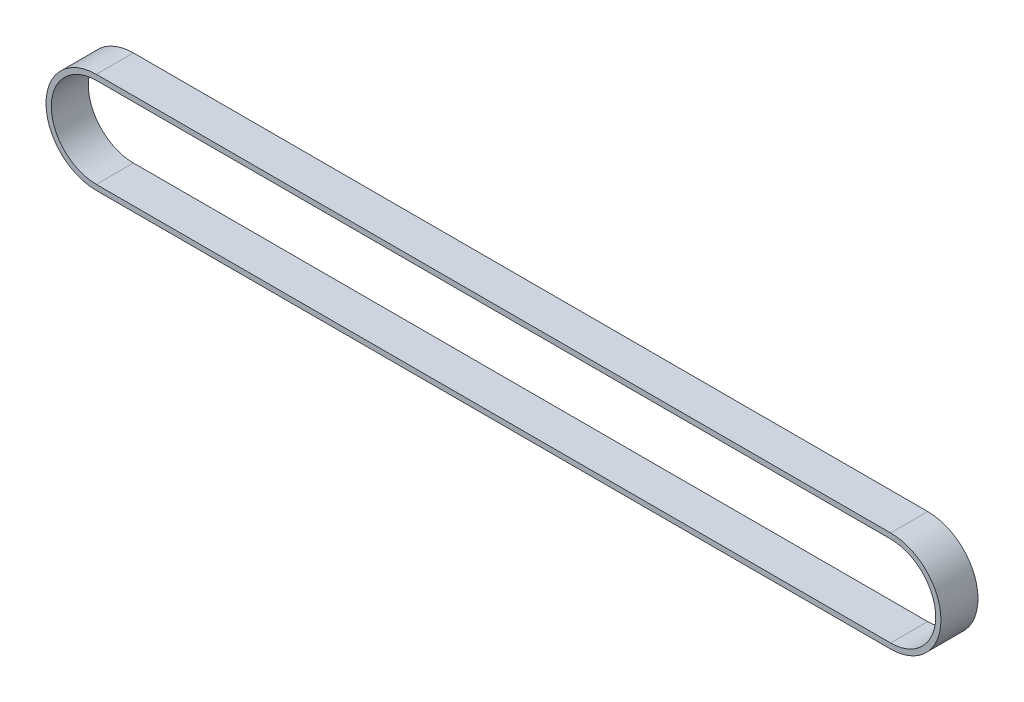
ISO-10303-21;
HEADER;
FILE_DESCRIPTION(('STEP AP214'),'2;1');
FILE_NAME('part.step','',(''),(''),'','','');
FILE_SCHEMA(('AUTOMOTIVE_DESIGN { 1 0 10303 214 1 1 1 1 }'));
ENDSEC;
DATA;
#1=APPLICATION_CONTEXT('core data for automotive mechanical design processes');
#2=APPLICATION_PROTOCOL_DEFINITION('international standard','automotive_design',2000,#1);
#3=PRODUCT_CONTEXT('',#1,'mechanical');
#4=PRODUCT('Part','Part','',(#3));
#5=PRODUCT_RELATED_PRODUCT_CATEGORY('part','',(#4));
#6=PRODUCT_DEFINITION_FORMATION('','',#4);
#7=PRODUCT_DEFINITION_CONTEXT('part definition',#1,'design');
#8=PRODUCT_DEFINITION('design','',#6,#7);
#9=PRODUCT_DEFINITION_SHAPE('','',#8);
#10=(LENGTH_UNIT() NAMED_UNIT(*) SI_UNIT(.MILLI.,.METRE.));
#11=(NAMED_UNIT(*) PLANE_ANGLE_UNIT() SI_UNIT($,.RADIAN.));
#12=(NAMED_UNIT(*) SI_UNIT($,.STERADIAN.) SOLID_ANGLE_UNIT());
#13=UNCERTAINTY_MEASURE_WITH_UNIT(LENGTH_MEASURE(1.E-05),#10,'distance_accuracy_value','');
#14=(GEOMETRIC_REPRESENTATION_CONTEXT(3) GLOBAL_UNCERTAINTY_ASSIGNED_CONTEXT((#13)) GLOBAL_UNIT_ASSIGNED_CONTEXT((#10,
#11,#12)) REPRESENTATION_CONTEXT('',''));
#15=CARTESIAN_POINT('',(0.,0.,0.));
#16=DIRECTION('',(0.,0.,1.));
#17=DIRECTION('',(1.,0.,0.));
#18=AXIS2_PLACEMENT_3D('',#15,#16,#17);
#19=CARTESIAN_POINT('',(-13.9170984455959,0.,14.));
#20=DIRECTION('',(0.,0.,1.));
#21=DIRECTION('',(1.,0.,0.));
#22=AXIS2_PLACEMENT_3D('',#19,#20,#21);
#23=PLANE('',#22);
#24=CARTESIAN_POINT('',(-13.9170984455959,0.,14.));
#25=DIRECTION('',(0.,0.,1.));
#26=DIRECTION('',(1.,0.,0.));
#27=AXIS2_PLACEMENT_3D('',#24,#25,#26);
#28=CIRCLE('',#27,19.);
#29=CARTESIAN_POINT('',(-13.9170984455959,19.,14.));
#30=VERTEX_POINT('',#29);
#31=CARTESIAN_POINT('',(-13.9170984455959,-19.,14.));
#32=VERTEX_POINT('',#31);
#33=EDGE_CURVE('E164',#30,#32,#28,.T.);
#34=ORIENTED_EDGE('',*,*,#33,.T.);
#35=DIRECTION('',(1.,0.,0.));
#36=VECTOR('',#35,1.);
#37=CARTESIAN_POINT('',(-13.9170984455959,-19.,14.));
#38=LINE('',#37,#36);
#39=CARTESIAN_POINT('',(286.082901554404,-19.,14.));
#40=VERTEX_POINT('',#39);
#41=EDGE_CURVE('E167',#32,#40,#38,.T.);
#42=ORIENTED_EDGE('',*,*,#41,.T.);
#43=CARTESIAN_POINT('',(286.082901554404,0.,14.));
#44=DIRECTION('',(0.,0.,1.));
#45=DIRECTION('',(1.,0.,0.));
#46=AXIS2_PLACEMENT_3D('',#43,#44,#45);
#47=CIRCLE('',#46,19.);
#48=CARTESIAN_POINT('',(286.082901554404,19.,14.));
#49=VERTEX_POINT('',#48);
#50=EDGE_CURVE('E170',#40,#49,#47,.T.);
#51=ORIENTED_EDGE('',*,*,#50,.T.);
#52=DIRECTION('',(-1.,0.,0.));
#53=VECTOR('',#52,1.);
#54=CARTESIAN_POINT('',(-13.9170984455959,19.,14.));
#55=LINE('',#54,#53);
#56=EDGE_CURVE('E172',#49,#30,#55,.T.);
#57=ORIENTED_EDGE('',*,*,#56,.T.);
#58=EDGE_LOOP('',(#34,#42,#51,#57));
#59=FACE_BOUND('',#58,.T.);
#60=DIRECTION('',(1.,0.,0.));
#61=VECTOR('',#60,1.);
#62=CARTESIAN_POINT('',(-13.9170984455959,-17.,14.));
#63=LINE('',#62,#61);
#64=CARTESIAN_POINT('',(-13.9170984455959,-17.,14.));
#65=VERTEX_POINT('',#64);
#66=CARTESIAN_POINT('',(286.082901554404,-17.,14.));
#67=VERTEX_POINT('',#66);
#68=EDGE_CURVE('E136',#65,#67,#63,.T.);
#69=ORIENTED_EDGE('',*,*,#68,.F.);
#70=CARTESIAN_POINT('',(-13.9170984455959,0.,14.));
#71=DIRECTION('',(0.,0.,1.));
#72=DIRECTION('',(1.,0.,0.));
#73=AXIS2_PLACEMENT_3D('',#70,#71,#72);
#74=CIRCLE('',#73,17.);
#75=CARTESIAN_POINT('',(-13.9170984455959,17.,14.));
#76=VERTEX_POINT('',#75);
#77=EDGE_CURVE('E128',#76,#65,#74,.T.);
#78=ORIENTED_EDGE('',*,*,#77,.F.);
#79=DIRECTION('',(-1.,0.,0.));
#80=VECTOR('',#79,1.);
#81=CARTESIAN_POINT('',(-13.9170984455959,17.,14.));
#82=LINE('',#81,#80);
#83=CARTESIAN_POINT('',(286.082901554404,17.,14.));
#84=VERTEX_POINT('',#83);
#85=EDGE_CURVE('E150',#84,#76,#82,.T.);
#86=ORIENTED_EDGE('',*,*,#85,.F.);
#87=CARTESIAN_POINT('',(286.082901554404,0.,14.));
#88=DIRECTION('',(0.,0.,1.));
#89=DIRECTION('',(1.,0.,0.));
#90=AXIS2_PLACEMENT_3D('',#87,#88,#89);
#91=CIRCLE('',#90,17.);
#92=EDGE_CURVE('E148',#67,#84,#91,.T.);
#93=ORIENTED_EDGE('',*,*,#92,.F.);
#94=EDGE_LOOP('',(#69,#78,#86,#93));
#95=FACE_BOUND('',#94,.T.);
#96=ADVANCED_FACE('F63',(#59,#95),#23,.T.);
#97=CARTESIAN_POINT('',(-13.9170984455959,0.,0.));
#98=DIRECTION('',(0.,0.,1.));
#99=DIRECTION('',(1.,0.,0.));
#100=AXIS2_PLACEMENT_3D('',#97,#98,#99);
#101=PLANE('',#100);
#102=CARTESIAN_POINT('',(-13.9170984455959,0.,0.));
#103=DIRECTION('',(0.,0.,1.));
#104=DIRECTION('',(1.,0.,0.));
#105=AXIS2_PLACEMENT_3D('',#102,#103,#104);
#106=CIRCLE('',#105,19.);
#107=CARTESIAN_POINT('',(-13.9170984455959,19.,0.));
#108=VERTEX_POINT('',#107);
#109=CARTESIAN_POINT('',(-13.9170984455959,-19.,0.));
#110=VERTEX_POINT('',#109);
#111=EDGE_CURVE('E144',#108,#110,#106,.T.);
#112=ORIENTED_EDGE('',*,*,#111,.F.);
#113=DIRECTION('',(-1.,0.,0.));
#114=VECTOR('',#113,1.);
#115=CARTESIAN_POINT('',(-13.9170984455959,19.,0.));
#116=LINE('',#115,#114);
#117=CARTESIAN_POINT('',(286.082901554404,19.,0.));
#118=VERTEX_POINT('',#117);
#119=EDGE_CURVE('E168',#118,#108,#116,.T.);
#120=ORIENTED_EDGE('',*,*,#119,.F.);
#121=CARTESIAN_POINT('',(286.082901554404,0.,0.));
#122=DIRECTION('',(0.,0.,1.));
#123=DIRECTION('',(1.,0.,0.));
#124=AXIS2_PLACEMENT_3D('',#121,#122,#123);
#125=CIRCLE('',#124,19.);
#126=CARTESIAN_POINT('',(286.082901554404,-19.,0.));
#127=VERTEX_POINT('',#126);
#128=EDGE_CURVE('E179',#127,#118,#125,.T.);
#129=ORIENTED_EDGE('',*,*,#128,.F.);
#130=DIRECTION('',(1.,0.,0.));
#131=VECTOR('',#130,1.);
#132=CARTESIAN_POINT('',(-13.9170984455959,-19.,0.));
#133=LINE('',#132,#131);
#134=EDGE_CURVE('E177',#110,#127,#133,.T.);
#135=ORIENTED_EDGE('',*,*,#134,.F.);
#136=EDGE_LOOP('',(#112,#120,#129,#135));
#137=FACE_BOUND('',#136,.T.);
#138=CARTESIAN_POINT('',(-13.9170984455959,0.,0.));
#139=DIRECTION('',(0.,0.,1.));
#140=DIRECTION('',(1.,0.,0.));
#141=AXIS2_PLACEMENT_3D('',#138,#139,#140);
#142=CIRCLE('',#141,17.);
#143=CARTESIAN_POINT('',(-13.9170984455959,17.,0.));
#144=VERTEX_POINT('',#143);
#145=CARTESIAN_POINT('',(-13.9170984455959,-17.,0.));
#146=VERTEX_POINT('',#145);
#147=EDGE_CURVE('E86',#144,#146,#142,.T.);
#148=ORIENTED_EDGE('',*,*,#147,.T.);
#149=DIRECTION('',(1.,0.,0.));
#150=VECTOR('',#149,1.);
#151=CARTESIAN_POINT('',(-13.9170984455959,-17.,0.));
#152=LINE('',#151,#150);
#153=CARTESIAN_POINT('',(286.082901554404,-17.,0.));
#154=VERTEX_POINT('',#153);
#155=EDGE_CURVE('E143',#146,#154,#152,.T.);
#156=ORIENTED_EDGE('',*,*,#155,.T.);
#157=CARTESIAN_POINT('',(286.082901554404,0.,0.));
#158=DIRECTION('',(0.,0.,1.));
#159=DIRECTION('',(1.,0.,0.));
#160=AXIS2_PLACEMENT_3D('',#157,#158,#159);
#161=CIRCLE('',#160,17.);
#162=CARTESIAN_POINT('',(286.082901554404,17.,0.));
#163=VERTEX_POINT('',#162);
#164=EDGE_CURVE('E156',#154,#163,#161,.T.);
#165=ORIENTED_EDGE('',*,*,#164,.T.);
#166=DIRECTION('',(-1.,0.,0.));
#167=VECTOR('',#166,1.);
#168=CARTESIAN_POINT('',(-13.9170984455959,17.,0.));
#169=LINE('',#168,#167);
#170=EDGE_CURVE('E137',#163,#144,#169,.T.);
#171=ORIENTED_EDGE('',*,*,#170,.T.);
#172=EDGE_LOOP('',(#148,#156,#165,#171));
#173=FACE_BOUND('',#172,.T.);
#174=ADVANCED_FACE('F197',(#137,#173),#101,.F.);
#175=CARTESIAN_POINT('',(-13.9170984455959,0.,14.));
#176=DIRECTION('',(0.,0.,-1.));
#177=DIRECTION('',(-1.,0.,0.));
#178=AXIS2_PLACEMENT_3D('',#175,#176,#177);
#179=CYLINDRICAL_SURFACE('',#178,19.);
#180=ORIENTED_EDGE('',*,*,#111,.T.);
#181=DIRECTION('',(0.,0.,-1.));
#182=VECTOR('',#181,1.);
#183=CARTESIAN_POINT('',(-13.9170984455959,-19.,14.));
#184=LINE('',#183,#182);
#185=EDGE_CURVE('E12',#32,#110,#184,.T.);
#186=ORIENTED_EDGE('',*,*,#185,.F.);
#187=ORIENTED_EDGE('',*,*,#33,.F.);
#188=DIRECTION('',(0.,0.,-1.));
#189=VECTOR('',#188,1.);
#190=CARTESIAN_POINT('',(-13.9170984455959,19.,14.));
#191=LINE('',#190,#189);
#192=EDGE_CURVE('E174',#30,#108,#191,.T.);
#193=ORIENTED_EDGE('',*,*,#192,.T.);
#194=EDGE_LOOP('',(#180,#186,#187,#193));
#195=FACE_BOUND('',#194,.T.);
#196=ADVANCED_FACE('F65',(#195),#179,.T.);
#197=CARTESIAN_POINT('',(-13.9170984455959,-19.,14.));
#198=DIRECTION('',(0.,1.,0.));
#199=DIRECTION('',(0.,0.,1.));
#200=AXIS2_PLACEMENT_3D('',#197,#198,#199);
#201=PLANE('',#200);
#202=ORIENTED_EDGE('',*,*,#134,.T.);
#203=DIRECTION('',(0.,0.,-1.));
#204=VECTOR('',#203,1.);
#205=CARTESIAN_POINT('',(286.082901554404,-19.,14.));
#206=LINE('',#205,#204);
#207=EDGE_CURVE('E71',#40,#127,#206,.T.);
#208=ORIENTED_EDGE('',*,*,#207,.F.);
#209=ORIENTED_EDGE('',*,*,#41,.F.);
#210=ORIENTED_EDGE('',*,*,#185,.T.);
#211=EDGE_LOOP('',(#202,#208,#209,#210));
#212=FACE_BOUND('',#211,.T.);
#213=ADVANCED_FACE('F207',(#212),#201,.F.);
#214=CARTESIAN_POINT('',(286.082901554404,0.,14.));
#215=DIRECTION('',(0.,0.,-1.));
#216=DIRECTION('',(-1.,0.,0.));
#217=AXIS2_PLACEMENT_3D('',#214,#215,#216);
#218=CYLINDRICAL_SURFACE('',#217,19.);
#219=ORIENTED_EDGE('',*,*,#128,.T.);
#220=DIRECTION('',(0.,0.,-1.));
#221=VECTOR('',#220,1.);
#222=CARTESIAN_POINT('',(286.082901554404,19.,14.));
#223=LINE('',#222,#221);
#224=EDGE_CURVE('E184',#49,#118,#223,.T.);
#225=ORIENTED_EDGE('',*,*,#224,.F.);
#226=ORIENTED_EDGE('',*,*,#50,.F.);
#227=ORIENTED_EDGE('',*,*,#207,.T.);
#228=EDGE_LOOP('',(#219,#225,#226,#227));
#229=FACE_BOUND('',#228,.T.);
#230=ADVANCED_FACE('F191',(#229),#218,.T.);
#231=CARTESIAN_POINT('',(-13.9170984455959,19.,14.));
#232=DIRECTION('',(0.,-1.,0.));
#233=DIRECTION('',(0.,0.,-1.));
#234=AXIS2_PLACEMENT_3D('',#231,#232,#233);
#235=PLANE('',#234);
#236=ORIENTED_EDGE('',*,*,#119,.T.);
#237=ORIENTED_EDGE('',*,*,#192,.F.);
#238=ORIENTED_EDGE('',*,*,#56,.F.);
#239=ORIENTED_EDGE('',*,*,#224,.T.);
#240=EDGE_LOOP('',(#236,#237,#238,#239));
#241=FACE_BOUND('',#240,.T.);
#242=ADVANCED_FACE('F201',(#241),#235,.F.);
#243=CARTESIAN_POINT('',(-13.9170984455959,0.,14.));
#244=DIRECTION('',(0.,0.,-1.));
#245=DIRECTION('',(-1.,0.,0.));
#246=AXIS2_PLACEMENT_3D('',#243,#244,#245);
#247=CYLINDRICAL_SURFACE('',#246,17.);
#248=ORIENTED_EDGE('',*,*,#147,.F.);
#249=DIRECTION('',(0.,0.,-1.));
#250=VECTOR('',#249,1.);
#251=CARTESIAN_POINT('',(-13.9170984455959,17.,14.));
#252=LINE('',#251,#250);
#253=EDGE_CURVE('E132',#76,#144,#252,.T.);
#254=ORIENTED_EDGE('',*,*,#253,.F.);
#255=ORIENTED_EDGE('',*,*,#77,.T.);
#256=DIRECTION('',(0.,0.,-1.));
#257=VECTOR('',#256,1.);
#258=CARTESIAN_POINT('',(-13.9170984455959,-17.,14.));
#259=LINE('',#258,#257);
#260=EDGE_CURVE('E131',#65,#146,#259,.T.);
#261=ORIENTED_EDGE('',*,*,#260,.T.);
#262=EDGE_LOOP('',(#248,#254,#255,#261));
#263=FACE_BOUND('',#262,.T.);
#264=ADVANCED_FACE('F130',(#263),#247,.F.);
#265=CARTESIAN_POINT('',(-13.9170984455959,-17.,14.));
#266=DIRECTION('',(0.,1.,0.));
#267=DIRECTION('',(0.,0.,1.));
#268=AXIS2_PLACEMENT_3D('',#265,#266,#267);
#269=PLANE('',#268);
#270=ORIENTED_EDGE('',*,*,#155,.F.);
#271=ORIENTED_EDGE('',*,*,#260,.F.);
#272=ORIENTED_EDGE('',*,*,#68,.T.);
#273=DIRECTION('',(0.,0.,-1.));
#274=VECTOR('',#273,1.);
#275=CARTESIAN_POINT('',(286.082901554404,-17.,14.));
#276=LINE('',#275,#274);
#277=EDGE_CURVE('E145',#67,#154,#276,.T.);
#278=ORIENTED_EDGE('',*,*,#277,.T.);
#279=EDGE_LOOP('',(#270,#271,#272,#278));
#280=FACE_BOUND('',#279,.T.);
#281=ADVANCED_FACE('F140',(#280),#269,.T.);
#282=CARTESIAN_POINT('',(286.082901554404,0.,14.));
#283=DIRECTION('',(0.,0.,-1.));
#284=DIRECTION('',(-1.,0.,0.));
#285=AXIS2_PLACEMENT_3D('',#282,#283,#284);
#286=CYLINDRICAL_SURFACE('',#285,17.);
#287=ORIENTED_EDGE('',*,*,#164,.F.);
#288=ORIENTED_EDGE('',*,*,#277,.F.);
#289=ORIENTED_EDGE('',*,*,#92,.T.);
#290=DIRECTION('',(0.,0.,-1.));
#291=VECTOR('',#290,1.);
#292=CARTESIAN_POINT('',(286.082901554404,17.,14.));
#293=LINE('',#292,#291);
#294=EDGE_CURVE('E78',#84,#163,#293,.T.);
#295=ORIENTED_EDGE('',*,*,#294,.T.);
#296=EDGE_LOOP('',(#287,#288,#289,#295));
#297=FACE_BOUND('',#296,.T.);
#298=ADVANCED_FACE('F230',(#297),#286,.F.);
#299=CARTESIAN_POINT('',(-13.9170984455959,17.,14.));
#300=DIRECTION('',(0.,-1.,0.));
#301=DIRECTION('',(0.,0.,-1.));
#302=AXIS2_PLACEMENT_3D('',#299,#300,#301);
#303=PLANE('',#302);
#304=ORIENTED_EDGE('',*,*,#170,.F.);
#305=ORIENTED_EDGE('',*,*,#294,.F.);
#306=ORIENTED_EDGE('',*,*,#85,.T.);
#307=ORIENTED_EDGE('',*,*,#253,.T.);
#308=EDGE_LOOP('',(#304,#305,#306,#307));
#309=FACE_BOUND('',#308,.T.);
#310=ADVANCED_FACE('F234',(#309),#303,.T.);
#311=CLOSED_SHELL('',(#96,#174,#196,#213,#230,#242,#264,#281,#298,#310));
#312=MANIFOLD_SOLID_BREP('B2',#311);
#313=ADVANCED_BREP_SHAPE_REPRESENTATION('',(#18,#312),#14);
#314=SHAPE_DEFINITION_REPRESENTATION(#9,#313);
ENDSEC;
END-ISO-10303-21;
